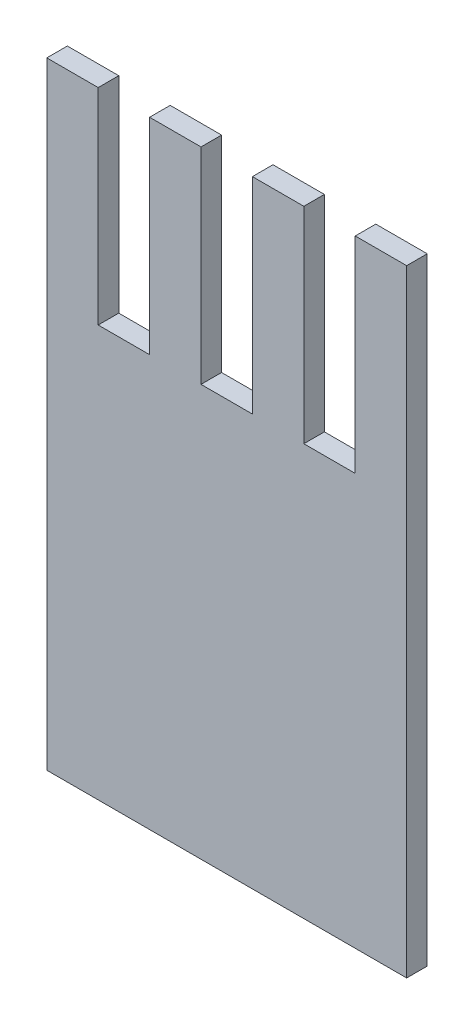
ISO-10303-21;
HEADER;
FILE_DESCRIPTION(('STEP AP214'),'2;1');
FILE_NAME('part.step','',(''),(''),'','','');
FILE_SCHEMA(('AUTOMOTIVE_DESIGN { 1 0 10303 214 1 1 1 1 }'));
ENDSEC;
DATA;
#1=APPLICATION_CONTEXT('core data for automotive mechanical design processes');
#2=APPLICATION_PROTOCOL_DEFINITION('international standard','automotive_design',2000,#1);
#3=PRODUCT_CONTEXT('',#1,'mechanical');
#4=PRODUCT('Part','Part','',(#3));
#5=PRODUCT_RELATED_PRODUCT_CATEGORY('part','',(#4));
#6=PRODUCT_DEFINITION_FORMATION('','',#4);
#7=PRODUCT_DEFINITION_CONTEXT('part definition',#1,'design');
#8=PRODUCT_DEFINITION('design','',#6,#7);
#9=PRODUCT_DEFINITION_SHAPE('','',#8);
#10=(LENGTH_UNIT() NAMED_UNIT(*) SI_UNIT(.MILLI.,.METRE.));
#11=(NAMED_UNIT(*) PLANE_ANGLE_UNIT() SI_UNIT($,.RADIAN.));
#12=(NAMED_UNIT(*) SI_UNIT($,.STERADIAN.) SOLID_ANGLE_UNIT());
#13=UNCERTAINTY_MEASURE_WITH_UNIT(LENGTH_MEASURE(1.E-05),#10,'distance_accuracy_value','');
#14=(GEOMETRIC_REPRESENTATION_CONTEXT(3) GLOBAL_UNCERTAINTY_ASSIGNED_CONTEXT((#13)) GLOBAL_UNIT_ASSIGNED_CONTEXT((#10,
#11,#12)) REPRESENTATION_CONTEXT('',''));
#15=CARTESIAN_POINT('',(0.,0.,0.));
#16=DIRECTION('',(0.,0.,1.));
#17=DIRECTION('',(1.,0.,0.));
#18=AXIS2_PLACEMENT_3D('',#15,#16,#17);
#19=CARTESIAN_POINT('',(-17.5,0.,2.));
#20=DIRECTION('',(1.,0.,0.));
#21=DIRECTION('',(0.,0.,-1.));
#22=AXIS2_PLACEMENT_3D('',#19,#20,#21);
#23=PLANE('',#22);
#24=DIRECTION('',(0.,-1.,0.));
#25=VECTOR('',#24,1.);
#26=CARTESIAN_POINT('',(-17.5,0.,0.));
#27=LINE('',#26,#25);
#28=CARTESIAN_POINT('',(-17.5,30.,0.));
#29=VERTEX_POINT('',#28);
#30=CARTESIAN_POINT('',(-17.5,-30.,0.));
#31=VERTEX_POINT('',#30);
#32=EDGE_CURVE('E115',#29,#31,#27,.T.);
#33=ORIENTED_EDGE('',*,*,#32,.T.);
#34=DIRECTION('',(0.,0.,-1.));
#35=VECTOR('',#34,1.);
#36=CARTESIAN_POINT('',(-17.5,-30.,2.));
#37=LINE('',#36,#35);
#38=CARTESIAN_POINT('',(-17.5,-30.,2.));
#39=VERTEX_POINT('',#38);
#40=EDGE_CURVE('E11',#39,#31,#37,.T.);
#41=ORIENTED_EDGE('',*,*,#40,.F.);
#42=DIRECTION('',(0.,-1.,0.));
#43=VECTOR('',#42,1.);
#44=CARTESIAN_POINT('',(-17.5,0.,2.));
#45=LINE('',#44,#43);
#46=CARTESIAN_POINT('',(-17.5,30.,2.));
#47=VERTEX_POINT('',#46);
#48=EDGE_CURVE('E64',#47,#39,#45,.T.);
#49=ORIENTED_EDGE('',*,*,#48,.F.);
#50=DIRECTION('',(0.,0.,-1.));
#51=VECTOR('',#50,1.);
#52=CARTESIAN_POINT('',(-17.5,30.,2.));
#53=LINE('',#52,#51);
#54=EDGE_CURVE('E182',#47,#29,#53,.T.);
#55=ORIENTED_EDGE('',*,*,#54,.T.);
#56=EDGE_LOOP('',(#33,#41,#49,#55));
#57=FACE_BOUND('',#56,.T.);
#58=ADVANCED_FACE('F35',(#57),#23,.F.);
#59=CARTESIAN_POINT('',(0.,-30.,2.));
#60=DIRECTION('',(0.,-1.,0.));
#61=DIRECTION('',(0.,0.,-1.));
#62=AXIS2_PLACEMENT_3D('',#59,#60,#61);
#63=PLANE('',#62);
#64=DIRECTION('',(-1.,0.,0.));
#65=VECTOR('',#64,1.);
#66=CARTESIAN_POINT('',(0.,-30.,0.));
#67=LINE('',#66,#65);
#68=CARTESIAN_POINT('',(17.5,-30.,0.));
#69=VERTEX_POINT('',#68);
#70=EDGE_CURVE('E252',#69,#31,#67,.T.);
#71=ORIENTED_EDGE('',*,*,#70,.F.);
#72=DIRECTION('',(0.,0.,-1.));
#73=VECTOR('',#72,1.);
#74=CARTESIAN_POINT('',(17.5,-30.,2.));
#75=LINE('',#74,#73);
#76=CARTESIAN_POINT('',(17.5,-30.,2.));
#77=VERTEX_POINT('',#76);
#78=EDGE_CURVE('E43',#77,#69,#75,.T.);
#79=ORIENTED_EDGE('',*,*,#78,.F.);
#80=DIRECTION('',(-1.,0.,0.));
#81=VECTOR('',#80,1.);
#82=CARTESIAN_POINT('',(0.,-30.,2.));
#83=LINE('',#82,#81);
#84=EDGE_CURVE('E247',#77,#39,#83,.T.);
#85=ORIENTED_EDGE('',*,*,#84,.T.);
#86=ORIENTED_EDGE('',*,*,#40,.T.);
#87=EDGE_LOOP('',(#71,#79,#85,#86));
#88=FACE_BOUND('',#87,.T.);
#89=ADVANCED_FACE('F257',(#88),#63,.T.);
#90=CARTESIAN_POINT('',(17.5,0.,2.));
#91=DIRECTION('',(1.,0.,0.));
#92=DIRECTION('',(0.,0.,-1.));
#93=AXIS2_PLACEMENT_3D('',#90,#91,#92);
#94=PLANE('',#93);
#95=DIRECTION('',(0.,-1.,0.));
#96=VECTOR('',#95,1.);
#97=CARTESIAN_POINT('',(17.5,0.,0.));
#98=LINE('',#97,#96);
#99=CARTESIAN_POINT('',(17.5,30.,0.));
#100=VERTEX_POINT('',#99);
#101=EDGE_CURVE('E248',#100,#69,#98,.T.);
#102=ORIENTED_EDGE('',*,*,#101,.F.);
#103=DIRECTION('',(0.,0.,-1.));
#104=VECTOR('',#103,1.);
#105=CARTESIAN_POINT('',(17.5,30.,2.));
#106=LINE('',#105,#104);
#107=CARTESIAN_POINT('',(17.5,30.,2.));
#108=VERTEX_POINT('',#107);
#109=EDGE_CURVE('E243',#108,#100,#106,.T.);
#110=ORIENTED_EDGE('',*,*,#109,.F.);
#111=DIRECTION('',(0.,-1.,0.));
#112=VECTOR('',#111,1.);
#113=CARTESIAN_POINT('',(17.5,0.,2.));
#114=LINE('',#113,#112);
#115=EDGE_CURVE('E123',#108,#77,#114,.T.);
#116=ORIENTED_EDGE('',*,*,#115,.T.);
#117=ORIENTED_EDGE('',*,*,#78,.T.);
#118=EDGE_LOOP('',(#102,#110,#116,#117));
#119=FACE_BOUND('',#118,.T.);
#120=ADVANCED_FACE('F256',(#119),#94,.T.);
#121=CARTESIAN_POINT('',(0.,0.,2.));
#122=DIRECTION('',(0.,0.,1.));
#123=DIRECTION('',(1.,0.,0.));
#124=AXIS2_PLACEMENT_3D('',#121,#122,#123);
#125=PLANE('',#124);
#126=ORIENTED_EDGE('',*,*,#115,.F.);
#127=DIRECTION('',(-1.,0.,0.));
#128=VECTOR('',#127,1.);
#129=CARTESIAN_POINT('',(0.,30.,2.));
#130=LINE('',#129,#128);
#131=CARTESIAN_POINT('',(12.5,30.,2.));
#132=VERTEX_POINT('',#131);
#133=EDGE_CURVE('E220',#108,#132,#130,.T.);
#134=ORIENTED_EDGE('',*,*,#133,.T.);
#135=DIRECTION('',(0.,-1.,0.));
#136=VECTOR('',#135,1.);
#137=CARTESIAN_POINT('',(12.5,0.,2.));
#138=LINE('',#137,#136);
#139=CARTESIAN_POINT('',(12.5,10.,2.));
#140=VERTEX_POINT('',#139);
#141=EDGE_CURVE('E269',#132,#140,#138,.T.);
#142=ORIENTED_EDGE('',*,*,#141,.T.);
#143=DIRECTION('',(1.,0.,0.));
#144=VECTOR('',#143,1.);
#145=CARTESIAN_POINT('',(0.,10.,2.));
#146=LINE('',#145,#144);
#147=CARTESIAN_POINT('',(7.49999999999999,10.,2.));
#148=VERTEX_POINT('',#147);
#149=EDGE_CURVE('E272',#148,#140,#146,.T.);
#150=ORIENTED_EDGE('',*,*,#149,.F.);
#151=DIRECTION('',(0.,-1.,0.));
#152=VECTOR('',#151,1.);
#153=CARTESIAN_POINT('',(7.49999999999999,0.,2.));
#154=LINE('',#153,#152);
#155=CARTESIAN_POINT('',(7.49999999999999,30.,2.));
#156=VERTEX_POINT('',#155);
#157=EDGE_CURVE('E274',#156,#148,#154,.T.);
#158=ORIENTED_EDGE('',*,*,#157,.F.);
#159=DIRECTION('',(1.,0.,0.));
#160=VECTOR('',#159,1.);
#161=CARTESIAN_POINT('',(0.,30.,2.));
#162=LINE('',#161,#160);
#163=CARTESIAN_POINT('',(2.5,30.,2.));
#164=VERTEX_POINT('',#163);
#165=EDGE_CURVE('E280',#164,#156,#162,.T.);
#166=ORIENTED_EDGE('',*,*,#165,.F.);
#167=DIRECTION('',(0.,-1.,0.));
#168=VECTOR('',#167,1.);
#169=CARTESIAN_POINT('',(2.5,0.,2.));
#170=LINE('',#169,#168);
#171=CARTESIAN_POINT('',(2.5,10.,2.));
#172=VERTEX_POINT('',#171);
#173=EDGE_CURVE('E283',#164,#172,#170,.T.);
#174=ORIENTED_EDGE('',*,*,#173,.T.);
#175=DIRECTION('',(1.,0.,0.));
#176=VECTOR('',#175,1.);
#177=CARTESIAN_POINT('',(0.,10.,2.));
#178=LINE('',#177,#176);
#179=CARTESIAN_POINT('',(-2.5,10.,2.));
#180=VERTEX_POINT('',#179);
#181=EDGE_CURVE('E285',#180,#172,#178,.T.);
#182=ORIENTED_EDGE('',*,*,#181,.F.);
#183=DIRECTION('',(0.,-1.,0.));
#184=VECTOR('',#183,1.);
#185=CARTESIAN_POINT('',(-2.5,0.,2.));
#186=LINE('',#185,#184);
#187=CARTESIAN_POINT('',(-2.5,30.,2.));
#188=VERTEX_POINT('',#187);
#189=EDGE_CURVE('E288',#188,#180,#186,.T.);
#190=ORIENTED_EDGE('',*,*,#189,.F.);
#191=DIRECTION('',(1.,0.,0.));
#192=VECTOR('',#191,1.);
#193=CARTESIAN_POINT('',(0.,30.,2.));
#194=LINE('',#193,#192);
#195=CARTESIAN_POINT('',(-7.5,30.,2.));
#196=VERTEX_POINT('',#195);
#197=EDGE_CURVE('E291',#196,#188,#194,.T.);
#198=ORIENTED_EDGE('',*,*,#197,.F.);
#199=DIRECTION('',(0.,-1.,0.));
#200=VECTOR('',#199,1.);
#201=CARTESIAN_POINT('',(-7.5,0.,2.));
#202=LINE('',#201,#200);
#203=CARTESIAN_POINT('',(-7.5,10.,2.));
#204=VERTEX_POINT('',#203);
#205=EDGE_CURVE('E175',#196,#204,#202,.T.);
#206=ORIENTED_EDGE('',*,*,#205,.T.);
#207=DIRECTION('',(1.,0.,0.));
#208=VECTOR('',#207,1.);
#209=CARTESIAN_POINT('',(0.,10.,2.));
#210=LINE('',#209,#208);
#211=CARTESIAN_POINT('',(-12.5,10.,2.));
#212=VERTEX_POINT('',#211);
#213=EDGE_CURVE('E160',#212,#204,#210,.T.);
#214=ORIENTED_EDGE('',*,*,#213,.F.);
#215=DIRECTION('',(0.,-1.,0.));
#216=VECTOR('',#215,1.);
#217=CARTESIAN_POINT('',(-12.5,0.,2.));
#218=LINE('',#217,#216);
#219=CARTESIAN_POINT('',(-12.5,30.,2.));
#220=VERTEX_POINT('',#219);
#221=EDGE_CURVE('E172',#220,#212,#218,.T.);
#222=ORIENTED_EDGE('',*,*,#221,.F.);
#223=DIRECTION('',(-1.,0.,0.));
#224=VECTOR('',#223,1.);
#225=CARTESIAN_POINT('',(0.,30.,2.));
#226=LINE('',#225,#224);
#227=EDGE_CURVE('E180',#220,#47,#226,.T.);
#228=ORIENTED_EDGE('',*,*,#227,.T.);
#229=ORIENTED_EDGE('',*,*,#48,.T.);
#230=ORIENTED_EDGE('',*,*,#84,.F.);
#231=EDGE_LOOP('',(#126,#134,#142,#150,#158,#166,#174,#182,#190,#198,#206,#214,#222,#228,#229,#230));
#232=FACE_BOUND('',#231,.T.);
#233=ADVANCED_FACE('F171',(#232),#125,.T.);
#234=CARTESIAN_POINT('',(0.,0.,0.));
#235=DIRECTION('',(0.,0.,1.));
#236=DIRECTION('',(1.,0.,0.));
#237=AXIS2_PLACEMENT_3D('',#234,#235,#236);
#238=PLANE('',#237);
#239=ORIENTED_EDGE('',*,*,#32,.F.);
#240=DIRECTION('',(-1.,0.,0.));
#241=VECTOR('',#240,1.);
#242=CARTESIAN_POINT('',(0.,30.,0.));
#243=LINE('',#242,#241);
#244=CARTESIAN_POINT('',(-12.5,30.,0.));
#245=VERTEX_POINT('',#244);
#246=EDGE_CURVE('E218',#245,#29,#243,.T.);
#247=ORIENTED_EDGE('',*,*,#246,.F.);
#248=DIRECTION('',(0.,-1.,0.));
#249=VECTOR('',#248,1.);
#250=CARTESIAN_POINT('',(-12.5,0.,0.));
#251=LINE('',#250,#249);
#252=CARTESIAN_POINT('',(-12.5,10.,0.));
#253=VERTEX_POINT('',#252);
#254=EDGE_CURVE('E216',#245,#253,#251,.T.);
#255=ORIENTED_EDGE('',*,*,#254,.T.);
#256=DIRECTION('',(1.,0.,0.));
#257=VECTOR('',#256,1.);
#258=CARTESIAN_POINT('',(0.,10.,0.));
#259=LINE('',#258,#257);
#260=CARTESIAN_POINT('',(-7.5,10.,0.));
#261=VERTEX_POINT('',#260);
#262=EDGE_CURVE('E162',#253,#261,#259,.T.);
#263=ORIENTED_EDGE('',*,*,#262,.T.);
#264=DIRECTION('',(0.,-1.,0.));
#265=VECTOR('',#264,1.);
#266=CARTESIAN_POINT('',(-7.5,0.,0.));
#267=LINE('',#266,#265);
#268=CARTESIAN_POINT('',(-7.5,30.,0.));
#269=VERTEX_POINT('',#268);
#270=EDGE_CURVE('E212',#269,#261,#267,.T.);
#271=ORIENTED_EDGE('',*,*,#270,.F.);
#272=DIRECTION('',(1.,0.,0.));
#273=VECTOR('',#272,1.);
#274=CARTESIAN_POINT('',(0.,30.,0.));
#275=LINE('',#274,#273);
#276=CARTESIAN_POINT('',(-2.5,30.,0.));
#277=VERTEX_POINT('',#276);
#278=EDGE_CURVE('E209',#269,#277,#275,.T.);
#279=ORIENTED_EDGE('',*,*,#278,.T.);
#280=DIRECTION('',(0.,-1.,0.));
#281=VECTOR('',#280,1.);
#282=CARTESIAN_POINT('',(-2.5,0.,0.));
#283=LINE('',#282,#281);
#284=CARTESIAN_POINT('',(-2.5,10.,0.));
#285=VERTEX_POINT('',#284);
#286=EDGE_CURVE('E206',#277,#285,#283,.T.);
#287=ORIENTED_EDGE('',*,*,#286,.T.);
#288=DIRECTION('',(1.,0.,0.));
#289=VECTOR('',#288,1.);
#290=CARTESIAN_POINT('',(0.,10.,0.));
#291=LINE('',#290,#289);
#292=CARTESIAN_POINT('',(2.5,10.,0.));
#293=VERTEX_POINT('',#292);
#294=EDGE_CURVE('E203',#285,#293,#291,.T.);
#295=ORIENTED_EDGE('',*,*,#294,.T.);
#296=DIRECTION('',(0.,-1.,0.));
#297=VECTOR('',#296,1.);
#298=CARTESIAN_POINT('',(2.5,0.,0.));
#299=LINE('',#298,#297);
#300=CARTESIAN_POINT('',(2.5,30.,0.));
#301=VERTEX_POINT('',#300);
#302=EDGE_CURVE('E200',#301,#293,#299,.T.);
#303=ORIENTED_EDGE('',*,*,#302,.F.);
#304=DIRECTION('',(1.,0.,0.));
#305=VECTOR('',#304,1.);
#306=CARTESIAN_POINT('',(0.,30.,0.));
#307=LINE('',#306,#305);
#308=CARTESIAN_POINT('',(7.49999999999999,30.,0.));
#309=VERTEX_POINT('',#308);
#310=EDGE_CURVE('E197',#301,#309,#307,.T.);
#311=ORIENTED_EDGE('',*,*,#310,.T.);
#312=DIRECTION('',(0.,-1.,0.));
#313=VECTOR('',#312,1.);
#314=CARTESIAN_POINT('',(7.49999999999999,0.,0.));
#315=LINE('',#314,#313);
#316=CARTESIAN_POINT('',(7.49999999999999,10.,0.));
#317=VERTEX_POINT('',#316);
#318=EDGE_CURVE('E194',#309,#317,#315,.T.);
#319=ORIENTED_EDGE('',*,*,#318,.T.);
#320=DIRECTION('',(1.,0.,0.));
#321=VECTOR('',#320,1.);
#322=CARTESIAN_POINT('',(0.,10.,0.));
#323=LINE('',#322,#321);
#324=CARTESIAN_POINT('',(12.5,10.,0.));
#325=VERTEX_POINT('',#324);
#326=EDGE_CURVE('E191',#317,#325,#323,.T.);
#327=ORIENTED_EDGE('',*,*,#326,.T.);
#328=DIRECTION('',(0.,-1.,0.));
#329=VECTOR('',#328,1.);
#330=CARTESIAN_POINT('',(12.5,0.,0.));
#331=LINE('',#330,#329);
#332=CARTESIAN_POINT('',(12.5,30.,0.));
#333=VERTEX_POINT('',#332);
#334=EDGE_CURVE('E188',#333,#325,#331,.T.);
#335=ORIENTED_EDGE('',*,*,#334,.F.);
#336=DIRECTION('',(-1.,0.,0.));
#337=VECTOR('',#336,1.);
#338=CARTESIAN_POINT('',(0.,30.,0.));
#339=LINE('',#338,#337);
#340=EDGE_CURVE('E186',#100,#333,#339,.T.);
#341=ORIENTED_EDGE('',*,*,#340,.F.);
#342=ORIENTED_EDGE('',*,*,#101,.T.);
#343=ORIENTED_EDGE('',*,*,#70,.T.);
#344=EDGE_LOOP('',(#239,#247,#255,#263,#271,#279,#287,#295,#303,#311,#319,#327,#335,#341,#342,#343));
#345=FACE_BOUND('',#344,.T.);
#346=ADVANCED_FACE('F259',(#345),#238,.F.);
#347=CARTESIAN_POINT('',(0.,30.,2.));
#348=DIRECTION('',(0.,-1.,0.));
#349=DIRECTION('',(0.,0.,-1.));
#350=AXIS2_PLACEMENT_3D('',#347,#348,#349);
#351=PLANE('',#350);
#352=ORIENTED_EDGE('',*,*,#340,.T.);
#353=DIRECTION('',(0.,0.,-1.));
#354=VECTOR('',#353,1.);
#355=CARTESIAN_POINT('',(12.5,30.,2.));
#356=LINE('',#355,#354);
#357=EDGE_CURVE('E240',#132,#333,#356,.T.);
#358=ORIENTED_EDGE('',*,*,#357,.F.);
#359=ORIENTED_EDGE('',*,*,#133,.F.);
#360=ORIENTED_EDGE('',*,*,#109,.T.);
#361=EDGE_LOOP('',(#352,#358,#359,#360));
#362=FACE_BOUND('',#361,.T.);
#363=ADVANCED_FACE('F263',(#362),#351,.F.);
#364=CARTESIAN_POINT('',(12.5,0.,2.));
#365=DIRECTION('',(1.,0.,0.));
#366=DIRECTION('',(0.,1.,0.));
#367=AXIS2_PLACEMENT_3D('',#364,#365,#366);
#368=PLANE('',#367);
#369=ORIENTED_EDGE('',*,*,#334,.T.);
#370=DIRECTION('',(0.,0.,-1.));
#371=VECTOR('',#370,1.);
#372=CARTESIAN_POINT('',(12.5,10.,2.));
#373=LINE('',#372,#371);
#374=EDGE_CURVE('E238',#140,#325,#373,.T.);
#375=ORIENTED_EDGE('',*,*,#374,.F.);
#376=ORIENTED_EDGE('',*,*,#141,.F.);
#377=ORIENTED_EDGE('',*,*,#357,.T.);
#378=EDGE_LOOP('',(#369,#375,#376,#377));
#379=FACE_BOUND('',#378,.T.);
#380=ADVANCED_FACE('F267',(#379),#368,.F.);
#381=CARTESIAN_POINT('',(0.,10.,2.));
#382=DIRECTION('',(0.,1.,0.));
#383=DIRECTION('',(0.,0.,1.));
#384=AXIS2_PLACEMENT_3D('',#381,#382,#383);
#385=PLANE('',#384);
#386=ORIENTED_EDGE('',*,*,#326,.F.);
#387=DIRECTION('',(0.,0.,-1.));
#388=VECTOR('',#387,1.);
#389=CARTESIAN_POINT('',(7.49999999999999,10.,2.));
#390=LINE('',#389,#388);
#391=EDGE_CURVE('E236',#148,#317,#390,.T.);
#392=ORIENTED_EDGE('',*,*,#391,.F.);
#393=ORIENTED_EDGE('',*,*,#149,.T.);
#394=ORIENTED_EDGE('',*,*,#374,.T.);
#395=EDGE_LOOP('',(#386,#392,#393,#394));
#396=FACE_BOUND('',#395,.T.);
#397=ADVANCED_FACE('F396',(#396),#385,.T.);
#398=CARTESIAN_POINT('',(7.49999999999999,0.,2.));
#399=DIRECTION('',(1.,0.,0.));
#400=DIRECTION('',(0.,0.,-1.));
#401=AXIS2_PLACEMENT_3D('',#398,#399,#400);
#402=PLANE('',#401);
#403=ORIENTED_EDGE('',*,*,#318,.F.);
#404=DIRECTION('',(0.,0.,-1.));
#405=VECTOR('',#404,1.);
#406=CARTESIAN_POINT('',(7.49999999999999,30.,2.));
#407=LINE('',#406,#405);
#408=EDGE_CURVE('E234',#156,#309,#407,.T.);
#409=ORIENTED_EDGE('',*,*,#408,.F.);
#410=ORIENTED_EDGE('',*,*,#157,.T.);
#411=ORIENTED_EDGE('',*,*,#391,.T.);
#412=EDGE_LOOP('',(#403,#409,#410,#411));
#413=FACE_BOUND('',#412,.T.);
#414=ADVANCED_FACE('F385',(#413),#402,.T.);
#415=CARTESIAN_POINT('',(0.,30.,2.));
#416=DIRECTION('',(0.,1.,0.));
#417=DIRECTION('',(0.,0.,1.));
#418=AXIS2_PLACEMENT_3D('',#415,#416,#417);
#419=PLANE('',#418);
#420=ORIENTED_EDGE('',*,*,#310,.F.);
#421=DIRECTION('',(0.,0.,-1.));
#422=VECTOR('',#421,1.);
#423=CARTESIAN_POINT('',(2.5,30.,2.));
#424=LINE('',#423,#422);
#425=EDGE_CURVE('E232',#164,#301,#424,.T.);
#426=ORIENTED_EDGE('',*,*,#425,.F.);
#427=ORIENTED_EDGE('',*,*,#165,.T.);
#428=ORIENTED_EDGE('',*,*,#408,.T.);
#429=EDGE_LOOP('',(#420,#426,#427,#428));
#430=FACE_BOUND('',#429,.T.);
#431=ADVANCED_FACE('F374',(#430),#419,.T.);
#432=CARTESIAN_POINT('',(2.5,0.,2.));
#433=DIRECTION('',(1.,0.,0.));
#434=DIRECTION('',(0.,1.,0.));
#435=AXIS2_PLACEMENT_3D('',#432,#433,#434);
#436=PLANE('',#435);
#437=ORIENTED_EDGE('',*,*,#302,.T.);
#438=DIRECTION('',(0.,0.,-1.));
#439=VECTOR('',#438,1.);
#440=CARTESIAN_POINT('',(2.5,10.,2.));
#441=LINE('',#440,#439);
#442=EDGE_CURVE('E230',#172,#293,#441,.T.);
#443=ORIENTED_EDGE('',*,*,#442,.F.);
#444=ORIENTED_EDGE('',*,*,#173,.F.);
#445=ORIENTED_EDGE('',*,*,#425,.T.);
#446=EDGE_LOOP('',(#437,#443,#444,#445));
#447=FACE_BOUND('',#446,.T.);
#448=ADVANCED_FACE('F363',(#447),#436,.F.);
#449=CARTESIAN_POINT('',(0.,10.,2.));
#450=DIRECTION('',(0.,1.,0.));
#451=DIRECTION('',(0.,0.,1.));
#452=AXIS2_PLACEMENT_3D('',#449,#450,#451);
#453=PLANE('',#452);
#454=ORIENTED_EDGE('',*,*,#294,.F.);
#455=DIRECTION('',(0.,0.,-1.));
#456=VECTOR('',#455,1.);
#457=CARTESIAN_POINT('',(-2.5,10.,2.));
#458=LINE('',#457,#456);
#459=EDGE_CURVE('E228',#180,#285,#458,.T.);
#460=ORIENTED_EDGE('',*,*,#459,.F.);
#461=ORIENTED_EDGE('',*,*,#181,.T.);
#462=ORIENTED_EDGE('',*,*,#442,.T.);
#463=EDGE_LOOP('',(#454,#460,#461,#462));
#464=FACE_BOUND('',#463,.T.);
#465=ADVANCED_FACE('F354',(#464),#453,.T.);
#466=CARTESIAN_POINT('',(-2.5,0.,2.));
#467=DIRECTION('',(1.,0.,0.));
#468=DIRECTION('',(0.,1.,0.));
#469=AXIS2_PLACEMENT_3D('',#466,#467,#468);
#470=PLANE('',#469);
#471=ORIENTED_EDGE('',*,*,#286,.F.);
#472=DIRECTION('',(0.,0.,-1.));
#473=VECTOR('',#472,1.);
#474=CARTESIAN_POINT('',(-2.5,30.,2.));
#475=LINE('',#474,#473);
#476=EDGE_CURVE('E226',#188,#277,#475,.T.);
#477=ORIENTED_EDGE('',*,*,#476,.F.);
#478=ORIENTED_EDGE('',*,*,#189,.T.);
#479=ORIENTED_EDGE('',*,*,#459,.T.);
#480=EDGE_LOOP('',(#471,#477,#478,#479));
#481=FACE_BOUND('',#480,.T.);
#482=ADVANCED_FACE('F300',(#481),#470,.T.);
#483=CARTESIAN_POINT('',(0.,30.,2.));
#484=DIRECTION('',(0.,1.,0.));
#485=DIRECTION('',(0.,0.,1.));
#486=AXIS2_PLACEMENT_3D('',#483,#484,#485);
#487=PLANE('',#486);
#488=ORIENTED_EDGE('',*,*,#278,.F.);
#489=DIRECTION('',(0.,0.,-1.));
#490=VECTOR('',#489,1.);
#491=CARTESIAN_POINT('',(-7.5,30.,2.));
#492=LINE('',#491,#490);
#493=EDGE_CURVE('E224',#196,#269,#492,.T.);
#494=ORIENTED_EDGE('',*,*,#493,.F.);
#495=ORIENTED_EDGE('',*,*,#197,.T.);
#496=ORIENTED_EDGE('',*,*,#476,.T.);
#497=EDGE_LOOP('',(#488,#494,#495,#496));
#498=FACE_BOUND('',#497,.T.);
#499=ADVANCED_FACE('F295',(#498),#487,.T.);
#500=CARTESIAN_POINT('',(-7.5,0.,2.));
#501=DIRECTION('',(1.,0.,0.));
#502=DIRECTION('',(0.,1.,0.));
#503=AXIS2_PLACEMENT_3D('',#500,#501,#502);
#504=PLANE('',#503);
#505=ORIENTED_EDGE('',*,*,#270,.T.);
#506=DIRECTION('',(0.,0.,-1.));
#507=VECTOR('',#506,1.);
#508=CARTESIAN_POINT('',(-7.5,10.,2.));
#509=LINE('',#508,#507);
#510=EDGE_CURVE('E167',#204,#261,#509,.T.);
#511=ORIENTED_EDGE('',*,*,#510,.F.);
#512=ORIENTED_EDGE('',*,*,#205,.F.);
#513=ORIENTED_EDGE('',*,*,#493,.T.);
#514=EDGE_LOOP('',(#505,#511,#512,#513));
#515=FACE_BOUND('',#514,.T.);
#516=ADVANCED_FACE('F304',(#515),#504,.F.);
#517=CARTESIAN_POINT('',(0.,10.,2.));
#518=DIRECTION('',(0.,1.,0.));
#519=DIRECTION('',(0.,0.,1.));
#520=AXIS2_PLACEMENT_3D('',#517,#518,#519);
#521=PLANE('',#520);
#522=ORIENTED_EDGE('',*,*,#262,.F.);
#523=DIRECTION('',(0.,0.,-1.));
#524=VECTOR('',#523,1.);
#525=CARTESIAN_POINT('',(-12.5,10.,2.));
#526=LINE('',#525,#524);
#527=EDGE_CURVE('E157',#212,#253,#526,.T.);
#528=ORIENTED_EDGE('',*,*,#527,.F.);
#529=ORIENTED_EDGE('',*,*,#213,.T.);
#530=ORIENTED_EDGE('',*,*,#510,.T.);
#531=EDGE_LOOP('',(#522,#528,#529,#530));
#532=FACE_BOUND('',#531,.T.);
#533=ADVANCED_FACE('F159',(#532),#521,.T.);
#534=CARTESIAN_POINT('',(-12.5,0.,2.));
#535=DIRECTION('',(1.,0.,0.));
#536=DIRECTION('',(0.,1.,0.));
#537=AXIS2_PLACEMENT_3D('',#534,#535,#536);
#538=PLANE('',#537);
#539=ORIENTED_EDGE('',*,*,#254,.F.);
#540=DIRECTION('',(0.,0.,-1.));
#541=VECTOR('',#540,1.);
#542=CARTESIAN_POINT('',(-12.5,30.,2.));
#543=LINE('',#542,#541);
#544=EDGE_CURVE('E168',#220,#245,#543,.T.);
#545=ORIENTED_EDGE('',*,*,#544,.F.);
#546=ORIENTED_EDGE('',*,*,#221,.T.);
#547=ORIENTED_EDGE('',*,*,#527,.T.);
#548=EDGE_LOOP('',(#539,#545,#546,#547));
#549=FACE_BOUND('',#548,.T.);
#550=ADVANCED_FACE('F178',(#549),#538,.T.);
#551=CARTESIAN_POINT('',(0.,30.,2.));
#552=DIRECTION('',(0.,-1.,0.));
#553=DIRECTION('',(0.,0.,-1.));
#554=AXIS2_PLACEMENT_3D('',#551,#552,#553);
#555=PLANE('',#554);
#556=ORIENTED_EDGE('',*,*,#246,.T.);
#557=ORIENTED_EDGE('',*,*,#54,.F.);
#558=ORIENTED_EDGE('',*,*,#227,.F.);
#559=ORIENTED_EDGE('',*,*,#544,.T.);
#560=EDGE_LOOP('',(#556,#557,#558,#559));
#561=FACE_BOUND('',#560,.T.);
#562=ADVANCED_FACE('F319',(#561),#555,.F.);
#563=CLOSED_SHELL('',(#58,#89,#120,#233,#346,#363,#380,#397,#414,#431,#448,#465,#482,#499,#516,
#533,#550,#562));
#564=MANIFOLD_SOLID_BREP('B2',#563);
#565=ADVANCED_BREP_SHAPE_REPRESENTATION('',(#18,#564),#14);
#566=SHAPE_DEFINITION_REPRESENTATION(#9,#565);
ENDSEC;
END-ISO-10303-21;
